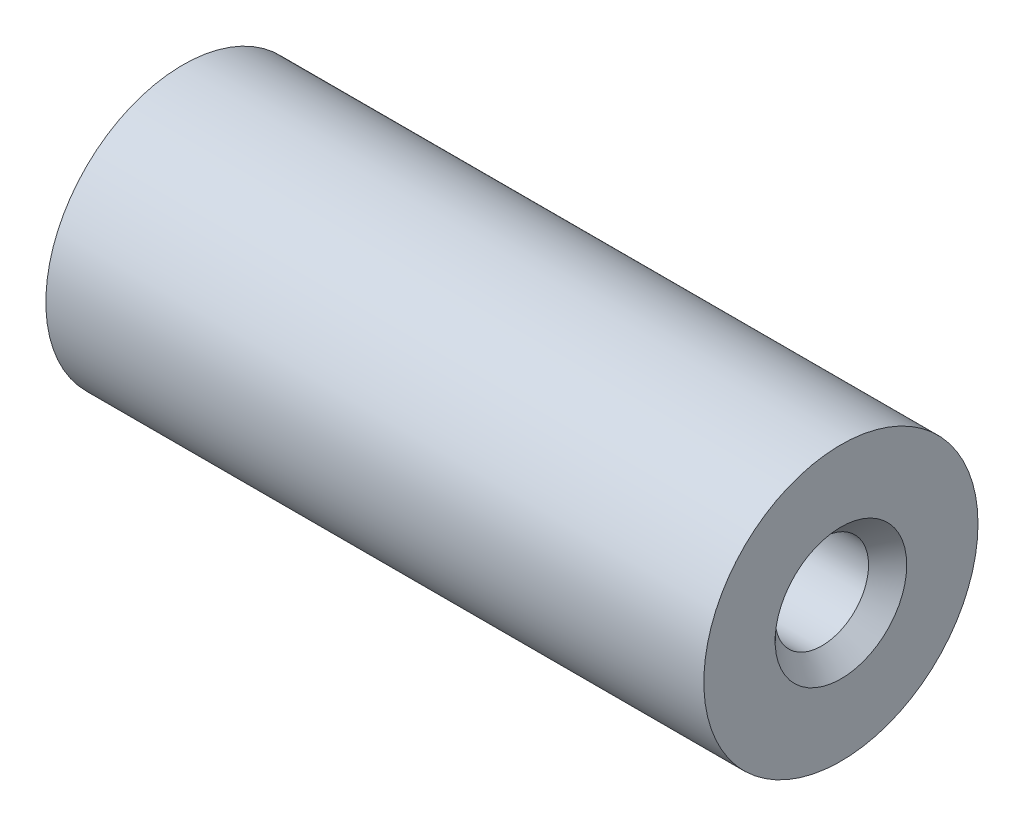
ISO-10303-21;
HEADER;
FILE_DESCRIPTION(('STEP AP214'),'2;1');
FILE_NAME('part.step','',(''),(''),'','','');
FILE_SCHEMA(('AUTOMOTIVE_DESIGN { 1 0 10303 214 1 1 1 1 }'));
ENDSEC;
DATA;
#1=APPLICATION_CONTEXT('core data for automotive mechanical design processes');
#2=APPLICATION_PROTOCOL_DEFINITION('international standard','automotive_design',2000,#1);
#3=PRODUCT_CONTEXT('',#1,'mechanical');
#4=PRODUCT('Part','Part','',(#3));
#5=PRODUCT_RELATED_PRODUCT_CATEGORY('part','',(#4));
#6=PRODUCT_DEFINITION_FORMATION('','',#4);
#7=PRODUCT_DEFINITION_CONTEXT('part definition',#1,'design');
#8=PRODUCT_DEFINITION('design','',#6,#7);
#9=PRODUCT_DEFINITION_SHAPE('','',#8);
#10=(LENGTH_UNIT() NAMED_UNIT(*) SI_UNIT(.MILLI.,.METRE.));
#11=(NAMED_UNIT(*) PLANE_ANGLE_UNIT() SI_UNIT($,.RADIAN.));
#12=(NAMED_UNIT(*) SI_UNIT($,.STERADIAN.) SOLID_ANGLE_UNIT());
#13=UNCERTAINTY_MEASURE_WITH_UNIT(LENGTH_MEASURE(1.E-05),#10,'distance_accuracy_value','');
#14=(GEOMETRIC_REPRESENTATION_CONTEXT(3) GLOBAL_UNCERTAINTY_ASSIGNED_CONTEXT((#13)) GLOBAL_UNIT_ASSIGNED_CONTEXT((#10,
#11,#12)) REPRESENTATION_CONTEXT('',''));
#15=CARTESIAN_POINT('',(0.,0.,0.));
#16=DIRECTION('',(0.,0.,1.));
#17=DIRECTION('',(1.,0.,0.));
#18=AXIS2_PLACEMENT_3D('',#15,#16,#17);
#19=CARTESIAN_POINT('',(0.,0.,0.));
#20=DIRECTION('',(-1.,0.,0.));
#21=DIRECTION('',(0.,0.,1.));
#22=AXIS2_PLACEMENT_3D('',#19,#20,#21);
#23=PLANE('',#22);
#24=CARTESIAN_POINT('',(0.,0.,0.));
#25=DIRECTION('',(-1.,0.,0.));
#26=DIRECTION('',(0.,0.,1.));
#27=AXIS2_PLACEMENT_3D('',#24,#25,#26);
#28=CIRCLE('',#27,4.60375);
#29=CARTESIAN_POINT('',(0.,0.,4.60375));
#30=VERTEX_POINT('',#29);
#31=EDGE_CURVE('E69',#30,#30,#28,.T.);
#32=ORIENTED_EDGE('',*,*,#31,.F.);
#33=EDGE_LOOP('',(#32));
#34=FACE_BOUND('',#33,.T.);
#35=CARTESIAN_POINT('',(0.,0.,0.));
#36=DIRECTION('',(1.,0.,0.));
#37=DIRECTION('',(0.,0.,-1.));
#38=AXIS2_PLACEMENT_3D('',#35,#36,#37);
#39=CIRCLE('',#38,7.9375);
#40=CARTESIAN_POINT('',(0.,0.,-7.9375));
#41=VERTEX_POINT('',#40);
#42=EDGE_CURVE('E11',#41,#41,#39,.T.);
#43=ORIENTED_EDGE('',*,*,#42,.F.);
#44=EDGE_LOOP('',(#43));
#45=FACE_BOUND('',#44,.T.);
#46=ADVANCED_FACE('F39',(#34,#45),#23,.T.);
#47=CARTESIAN_POINT('',(0.,0.,0.));
#48=DIRECTION('',(1.,0.,0.));
#49=DIRECTION('',(0.,0.,-1.));
#50=AXIS2_PLACEMENT_3D('',#47,#48,#49);
#51=CYLINDRICAL_SURFACE('',#50,7.9375);
#52=ORIENTED_EDGE('',*,*,#42,.T.);
#53=EDGE_LOOP('',(#52));
#54=FACE_BOUND('',#53,.T.);
#55=CARTESIAN_POINT('',(38.1,0.,0.));
#56=DIRECTION('',(1.,0.,0.));
#57=DIRECTION('',(0.,0.,-1.));
#58=AXIS2_PLACEMENT_3D('',#55,#56,#57);
#59=CIRCLE('',#58,7.9375);
#60=CARTESIAN_POINT('',(38.1,0.,-7.9375));
#61=VERTEX_POINT('',#60);
#62=EDGE_CURVE('E46',#61,#61,#59,.T.);
#63=ORIENTED_EDGE('',*,*,#62,.F.);
#64=EDGE_LOOP('',(#63));
#65=FACE_BOUND('',#64,.T.);
#66=ADVANCED_FACE('F82',(#54,#65),#51,.T.);
#67=CARTESIAN_POINT('',(38.1,0.,0.));
#68=DIRECTION('',(1.,0.,0.));
#69=DIRECTION('',(0.,0.,-1.));
#70=AXIS2_PLACEMENT_3D('',#67,#68,#69);
#71=PLANE('',#70);
#72=CARTESIAN_POINT('',(38.1,0.,0.));
#73=DIRECTION('',(1.,0.,0.));
#74=DIRECTION('',(0.,0.,-1.));
#75=AXIS2_PLACEMENT_3D('',#72,#73,#74);
#76=CIRCLE('',#75,3.81);
#77=CARTESIAN_POINT('',(38.1,0.,-3.81));
#78=VERTEX_POINT('',#77);
#79=EDGE_CURVE('E62',#78,#78,#76,.T.);
#80=ORIENTED_EDGE('',*,*,#79,.F.);
#81=EDGE_LOOP('',(#80));
#82=FACE_BOUND('',#81,.T.);
#83=ORIENTED_EDGE('',*,*,#62,.T.);
#84=EDGE_LOOP('',(#83));
#85=FACE_BOUND('',#84,.T.);
#86=ADVANCED_FACE('F80',(#82,#85),#71,.T.);
#87=CARTESIAN_POINT('',(25.4,0.,0.));
#88=DIRECTION('',(1.,0.,0.));
#89=DIRECTION('',(0.,0.,-1.));
#90=AXIS2_PLACEMENT_3D('',#87,#88,#89);
#91=CONICAL_SURFACE('',#90,2.7051,1.02974425867665);
#92=CARTESIAN_POINT('',(23.7746119394685,0.,0.));
#93=VERTEX_POINT('',#92);
#94=VERTEX_LOOP('',#93);
#95=FACE_BOUND('',#94,.T.);
#96=CARTESIAN_POINT('',(25.4,0.,0.));
#97=DIRECTION('',(1.,0.,0.));
#98=DIRECTION('',(0.,0.,-1.));
#99=AXIS2_PLACEMENT_3D('',#96,#97,#98);
#100=CIRCLE('',#99,2.7051);
#101=CARTESIAN_POINT('',(25.4,0.,-2.7051));
#102=VERTEX_POINT('',#101);
#103=EDGE_CURVE('E75',#102,#102,#100,.T.);
#104=ORIENTED_EDGE('',*,*,#103,.T.);
#105=EDGE_LOOP('',(#104));
#106=FACE_BOUND('',#105,.T.);
#107=ADVANCED_FACE('F89',(#95,#106),#91,.F.);
#108=CARTESIAN_POINT('',(38.1,0.,0.));
#109=DIRECTION('',(1.,0.,0.));
#110=DIRECTION('',(0.,0.,-1.));
#111=AXIS2_PLACEMENT_3D('',#108,#109,#110);
#112=CYLINDRICAL_SURFACE('',#111,2.7051);
#113=ORIENTED_EDGE('',*,*,#103,.F.);
#114=EDGE_LOOP('',(#113));
#115=FACE_BOUND('',#114,.T.);
#116=CARTESIAN_POINT('',(36.9951,0.,0.));
#117=DIRECTION('',(1.,0.,0.));
#118=DIRECTION('',(0.,0.,-1.));
#119=AXIS2_PLACEMENT_3D('',#116,#117,#118);
#120=CIRCLE('',#119,2.7051);
#121=CARTESIAN_POINT('',(36.9951,0.,-2.7051));
#122=VERTEX_POINT('',#121);
#123=EDGE_CURVE('E66',#122,#122,#120,.T.);
#124=ORIENTED_EDGE('',*,*,#123,.T.);
#125=EDGE_LOOP('',(#124));
#126=FACE_BOUND('',#125,.T.);
#127=ADVANCED_FACE('F96',(#115,#126),#112,.F.);
#128=CARTESIAN_POINT('',(38.1,0.,0.));
#129=DIRECTION('',(1.,0.,0.));
#130=DIRECTION('',(0.,0.,-1.));
#131=AXIS2_PLACEMENT_3D('',#128,#129,#130);
#132=CONICAL_SURFACE('',#131,3.81,0.78539816339745);
#133=ORIENTED_EDGE('',*,*,#123,.F.);
#134=EDGE_LOOP('',(#133));
#135=FACE_BOUND('',#134,.T.);
#136=ORIENTED_EDGE('',*,*,#79,.T.);
#137=EDGE_LOOP('',(#136));
#138=FACE_BOUND('',#137,.T.);
#139=ADVANCED_FACE('F56',(#135,#138),#132,.F.);
#140=CARTESIAN_POINT('',(12.7,0.,0.));
#141=DIRECTION('',(-1.,0.,0.));
#142=DIRECTION('',(0.,0.,1.));
#143=AXIS2_PLACEMENT_3D('',#140,#141,#142);
#144=CONICAL_SURFACE('',#143,3.4544,1.02974425867665);
#145=CARTESIAN_POINT('',(14.7756129223688,0.,0.));
#146=VERTEX_POINT('',#145);
#147=VERTEX_LOOP('',#146);
#148=FACE_BOUND('',#147,.T.);
#149=CARTESIAN_POINT('',(12.7,0.,0.));
#150=DIRECTION('',(-1.,0.,0.));
#151=DIRECTION('',(0.,0.,1.));
#152=AXIS2_PLACEMENT_3D('',#149,#150,#151);
#153=CIRCLE('',#152,3.4544);
#154=CARTESIAN_POINT('',(12.7,0.,3.4544));
#155=VERTEX_POINT('',#154);
#156=EDGE_CURVE('E60',#155,#155,#153,.T.);
#157=ORIENTED_EDGE('',*,*,#156,.T.);
#158=EDGE_LOOP('',(#157));
#159=FACE_BOUND('',#158,.T.);
#160=ADVANCED_FACE('F52',(#148,#159),#144,.F.);
#161=CARTESIAN_POINT('',(0.,0.,0.));
#162=DIRECTION('',(-1.,0.,0.));
#163=DIRECTION('',(0.,0.,1.));
#164=AXIS2_PLACEMENT_3D('',#161,#162,#163);
#165=CYLINDRICAL_SURFACE('',#164,3.4544);
#166=ORIENTED_EDGE('',*,*,#156,.F.);
#167=EDGE_LOOP('',(#166));
#168=FACE_BOUND('',#167,.T.);
#169=CARTESIAN_POINT('',(1.14935,0.,0.));
#170=DIRECTION('',(-1.,0.,0.));
#171=DIRECTION('',(0.,0.,1.));
#172=AXIS2_PLACEMENT_3D('',#169,#170,#171);
#173=CIRCLE('',#172,3.4544);
#174=CARTESIAN_POINT('',(1.14935,0.,3.4544));
#175=VERTEX_POINT('',#174);
#176=EDGE_CURVE('E63',#175,#175,#173,.T.);
#177=ORIENTED_EDGE('',*,*,#176,.T.);
#178=EDGE_LOOP('',(#177));
#179=FACE_BOUND('',#178,.T.);
#180=ADVANCED_FACE('F55',(#168,#179),#165,.F.);
#181=CARTESIAN_POINT('',(0.,0.,0.));
#182=DIRECTION('',(-1.,0.,0.));
#183=DIRECTION('',(0.,0.,1.));
#184=AXIS2_PLACEMENT_3D('',#181,#182,#183);
#185=CONICAL_SURFACE('',#184,4.60375,0.785398163397449);
#186=ORIENTED_EDGE('',*,*,#176,.F.);
#187=EDGE_LOOP('',(#186));
#188=FACE_BOUND('',#187,.T.);
#189=ORIENTED_EDGE('',*,*,#31,.T.);
#190=EDGE_LOOP('',(#189));
#191=FACE_BOUND('',#190,.T.);
#192=ADVANCED_FACE('F105',(#188,#191),#185,.F.);
#193=CLOSED_SHELL('',(#46,#66,#86,#107,#127,#139,#160,#180,#192));
#194=MANIFOLD_SOLID_BREP('B2',#193);
#195=ADVANCED_BREP_SHAPE_REPRESENTATION('',(#18,#194),#14);
#196=SHAPE_DEFINITION_REPRESENTATION(#9,#195);
ENDSEC;
END-ISO-10303-21;
